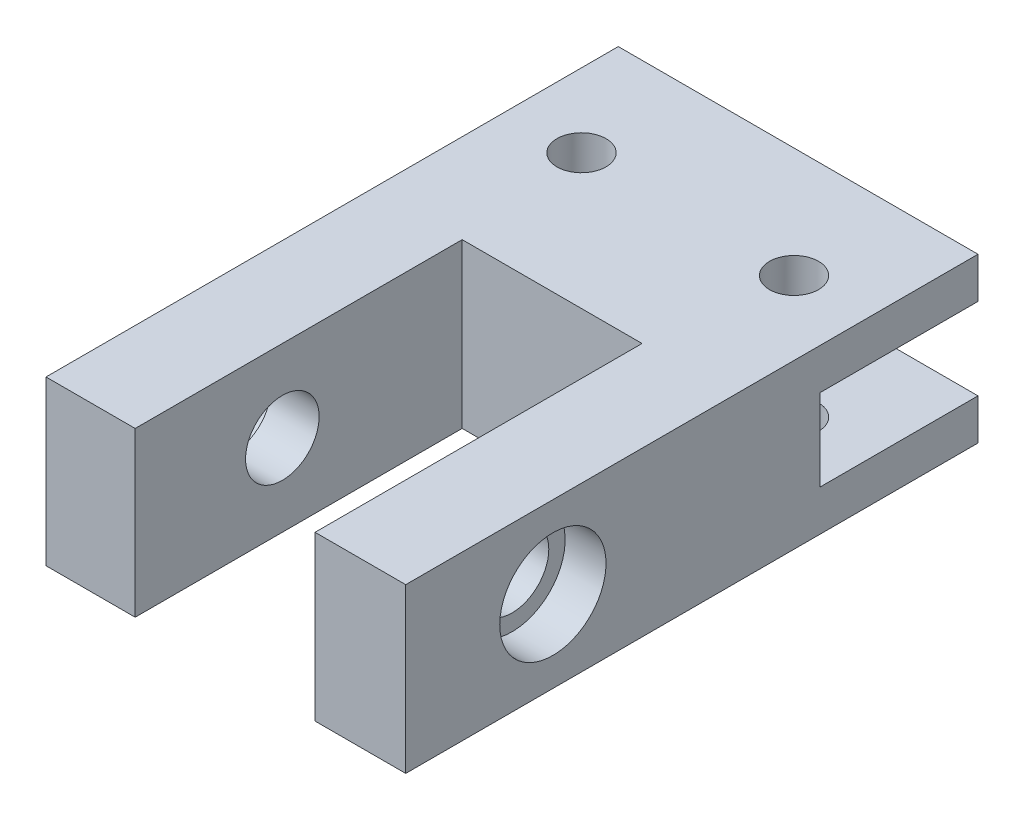
ISO-10303-21;
HEADER;
FILE_DESCRIPTION(('STEP AP214'),'2;1');
FILE_NAME('part.step','',(''),(''),'','','');
FILE_SCHEMA(('AUTOMOTIVE_DESIGN { 1 0 10303 214 1 1 1 1 }'));
ENDSEC;
DATA;
#1=APPLICATION_CONTEXT('core data for automotive mechanical design processes');
#2=APPLICATION_PROTOCOL_DEFINITION('international standard','automotive_design',2000,#1);
#3=PRODUCT_CONTEXT('',#1,'mechanical');
#4=PRODUCT('Part','Part','',(#3));
#5=PRODUCT_RELATED_PRODUCT_CATEGORY('part','',(#4));
#6=PRODUCT_DEFINITION_FORMATION('','',#4);
#7=PRODUCT_DEFINITION_CONTEXT('part definition',#1,'design');
#8=PRODUCT_DEFINITION('design','',#6,#7);
#9=PRODUCT_DEFINITION_SHAPE('','',#8);
#10=(LENGTH_UNIT() NAMED_UNIT(*) SI_UNIT(.MILLI.,.METRE.));
#11=(NAMED_UNIT(*) PLANE_ANGLE_UNIT() SI_UNIT($,.RADIAN.));
#12=(NAMED_UNIT(*) SI_UNIT($,.STERADIAN.) SOLID_ANGLE_UNIT());
#13=UNCERTAINTY_MEASURE_WITH_UNIT(LENGTH_MEASURE(1.E-05),#10,'distance_accuracy_value','');
#14=(GEOMETRIC_REPRESENTATION_CONTEXT(3) GLOBAL_UNCERTAINTY_ASSIGNED_CONTEXT((#13)) GLOBAL_UNIT_ASSIGNED_CONTEXT((#10,
#11,#12)) REPRESENTATION_CONTEXT('',''));
#15=CARTESIAN_POINT('',(0.,0.,0.));
#16=DIRECTION('',(0.,0.,1.));
#17=DIRECTION('',(1.,0.,0.));
#18=AXIS2_PLACEMENT_3D('',#15,#16,#17);
#19=CARTESIAN_POINT('',(22.,-10.,70.));
#20=DIRECTION('',(-1.,0.,0.));
#21=DIRECTION('',(0.,0.,1.));
#22=AXIS2_PLACEMENT_3D('',#19,#20,#21);
#23=PLANE('',#22);
#24=CARTESIAN_POINT('',(22.,0.,52.));
#25=DIRECTION('',(-1.,0.,0.));
#26=DIRECTION('',(0.,0.,1.));
#27=AXIS2_PLACEMENT_3D('',#24,#25,#26);
#28=CIRCLE('',#27,6.49999999999999);
#29=CARTESIAN_POINT('',(22.,0.,58.5));
#30=VERTEX_POINT('',#29);
#31=EDGE_CURVE('E275',#30,#30,#28,.T.);
#32=ORIENTED_EDGE('',*,*,#31,.T.);
#33=EDGE_LOOP('',(#32));
#34=FACE_BOUND('',#33,.T.);
#35=DIRECTION('',(0.,0.,-1.));
#36=VECTOR('',#35,1.);
#37=CARTESIAN_POINT('',(22.,5.,19.3492424049175));
#38=LINE('',#37,#36);
#39=CARTESIAN_POINT('',(22.,5.,19.3492424049175));
#40=VERTEX_POINT('',#39);
#41=CARTESIAN_POINT('',(22.,5.,0.));
#42=VERTEX_POINT('',#41);
#43=EDGE_CURVE('E424',#40,#42,#38,.T.);
#44=ORIENTED_EDGE('',*,*,#43,.T.);
#45=DIRECTION('',(0.,1.,0.));
#46=VECTOR('',#45,1.);
#47=CARTESIAN_POINT('',(22.,-10.,0.));
#48=LINE('',#47,#46);
#49=CARTESIAN_POINT('',(22.,10.,0.));
#50=VERTEX_POINT('',#49);
#51=EDGE_CURVE('E310',#42,#50,#48,.T.);
#52=ORIENTED_EDGE('',*,*,#51,.T.);
#53=DIRECTION('',(0.,0.,-1.));
#54=VECTOR('',#53,1.);
#55=CARTESIAN_POINT('',(22.,10.,70.));
#56=LINE('',#55,#54);
#57=CARTESIAN_POINT('',(22.,10.,70.));
#58=VERTEX_POINT('',#57);
#59=EDGE_CURVE('E11',#58,#50,#56,.T.);
#60=ORIENTED_EDGE('',*,*,#59,.F.);
#61=DIRECTION('',(0.,1.,0.));
#62=VECTOR('',#61,1.);
#63=CARTESIAN_POINT('',(22.,-10.,70.));
#64=LINE('',#63,#62);
#65=CARTESIAN_POINT('',(22.,-10.,70.));
#66=VERTEX_POINT('',#65);
#67=EDGE_CURVE('E321',#66,#58,#64,.T.);
#68=ORIENTED_EDGE('',*,*,#67,.F.);
#69=DIRECTION('',(0.,0.,-1.));
#70=VECTOR('',#69,1.);
#71=CARTESIAN_POINT('',(22.,-10.,70.));
#72=LINE('',#71,#70);
#73=CARTESIAN_POINT('',(22.,-10.,0.));
#74=VERTEX_POINT('',#73);
#75=EDGE_CURVE('E339',#66,#74,#72,.T.);
#76=ORIENTED_EDGE('',*,*,#75,.T.);
#77=CARTESIAN_POINT('',(22.,-5.,0.));
#78=VERTEX_POINT('',#77);
#79=EDGE_CURVE('E340',#74,#78,#48,.T.);
#80=ORIENTED_EDGE('',*,*,#79,.T.);
#81=DIRECTION('',(0.,0.,-1.));
#82=VECTOR('',#81,1.);
#83=CARTESIAN_POINT('',(22.,-5.,19.3492424049175));
#84=LINE('',#83,#82);
#85=CARTESIAN_POINT('',(22.,-5.,19.3492424049175));
#86=VERTEX_POINT('',#85);
#87=EDGE_CURVE('E64',#86,#78,#84,.T.);
#88=ORIENTED_EDGE('',*,*,#87,.F.);
#89=DIRECTION('',(0.,-1.,0.));
#90=VECTOR('',#89,1.);
#91=CARTESIAN_POINT('',(22.,5.,19.3492424049175));
#92=LINE('',#91,#90);
#93=EDGE_CURVE('E427',#40,#86,#92,.T.);
#94=ORIENTED_EDGE('',*,*,#93,.F.);
#95=EDGE_LOOP('',(#44,#52,#60,#68,#76,#80,#88,#94));
#96=FACE_BOUND('',#95,.T.);
#97=ADVANCED_FACE('F39',(#34,#96),#23,.F.);
#98=CARTESIAN_POINT('',(-22.,-10.,70.));
#99=DIRECTION('',(1.,0.,0.));
#100=DIRECTION('',(0.,0.,-1.));
#101=AXIS2_PLACEMENT_3D('',#98,#99,#100);
#102=PLANE('',#101);
#103=CARTESIAN_POINT('',(-22.,0.,52.));
#104=DIRECTION('',(-1.,0.,0.));
#105=DIRECTION('',(0.,0.,1.));
#106=AXIS2_PLACEMENT_3D('',#103,#104,#105);
#107=CIRCLE('',#106,6.49999999999999);
#108=CARTESIAN_POINT('',(-22.,0.,58.5));
#109=VERTEX_POINT('',#108);
#110=EDGE_CURVE('E261',#109,#109,#107,.T.);
#111=ORIENTED_EDGE('',*,*,#110,.F.);
#112=EDGE_LOOP('',(#111));
#113=FACE_BOUND('',#112,.T.);
#114=DIRECTION('',(0.,0.,1.));
#115=VECTOR('',#114,1.);
#116=CARTESIAN_POINT('',(-22.,5.,19.3492424049175));
#117=LINE('',#116,#115);
#118=CARTESIAN_POINT('',(-22.,5.,0.));
#119=VERTEX_POINT('',#118);
#120=CARTESIAN_POINT('',(-22.,5.,19.3492424049175));
#121=VERTEX_POINT('',#120);
#122=EDGE_CURVE('E235',#119,#121,#117,.T.);
#123=ORIENTED_EDGE('',*,*,#122,.T.);
#124=DIRECTION('',(0.,-1.,0.));
#125=VECTOR('',#124,1.);
#126=CARTESIAN_POINT('',(-22.,5.,19.3492424049175));
#127=LINE('',#126,#125);
#128=CARTESIAN_POINT('',(-22.,-5.,19.3492424049175));
#129=VERTEX_POINT('',#128);
#130=EDGE_CURVE('E239',#121,#129,#127,.T.);
#131=ORIENTED_EDGE('',*,*,#130,.T.);
#132=DIRECTION('',(0.,0.,1.));
#133=VECTOR('',#132,1.);
#134=CARTESIAN_POINT('',(-22.,-5.,19.3492424049175));
#135=LINE('',#134,#133);
#136=CARTESIAN_POINT('',(-22.,-5.,0.));
#137=VERTEX_POINT('',#136);
#138=EDGE_CURVE('E217',#137,#129,#135,.T.);
#139=ORIENTED_EDGE('',*,*,#138,.F.);
#140=DIRECTION('',(0.,-1.,0.));
#141=VECTOR('',#140,1.);
#142=CARTESIAN_POINT('',(-22.,-10.,0.));
#143=LINE('',#142,#141);
#144=CARTESIAN_POINT('',(-22.,-10.,0.));
#145=VERTEX_POINT('',#144);
#146=EDGE_CURVE('E346',#137,#145,#143,.T.);
#147=ORIENTED_EDGE('',*,*,#146,.T.);
#148=DIRECTION('',(0.,0.,-1.));
#149=VECTOR('',#148,1.);
#150=CARTESIAN_POINT('',(-22.,-10.,70.));
#151=LINE('',#150,#149);
#152=CARTESIAN_POINT('',(-22.,-10.,70.));
#153=VERTEX_POINT('',#152);
#154=EDGE_CURVE('E356',#153,#145,#151,.T.);
#155=ORIENTED_EDGE('',*,*,#154,.F.);
#156=DIRECTION('',(0.,-1.,0.));
#157=VECTOR('',#156,1.);
#158=CARTESIAN_POINT('',(-22.,-10.,70.));
#159=LINE('',#158,#157);
#160=CARTESIAN_POINT('',(-22.,10.,70.));
#161=VERTEX_POINT('',#160);
#162=EDGE_CURVE('E331',#161,#153,#159,.T.);
#163=ORIENTED_EDGE('',*,*,#162,.F.);
#164=DIRECTION('',(0.,0.,-1.));
#165=VECTOR('',#164,1.);
#166=CARTESIAN_POINT('',(-22.,10.,70.));
#167=LINE('',#166,#165);
#168=CARTESIAN_POINT('',(-22.,10.,0.));
#169=VERTEX_POINT('',#168);
#170=EDGE_CURVE('E48',#161,#169,#167,.T.);
#171=ORIENTED_EDGE('',*,*,#170,.T.);
#172=EDGE_CURVE('E347',#169,#119,#143,.T.);
#173=ORIENTED_EDGE('',*,*,#172,.T.);
#174=EDGE_LOOP('',(#123,#131,#139,#147,#155,#163,#171,#173));
#175=FACE_BOUND('',#174,.T.);
#176=ADVANCED_FACE('F405',(#113,#175),#102,.F.);
#177=CARTESIAN_POINT('',(0.,0.,0.));
#178=DIRECTION('',(0.,0.,-1.));
#179=DIRECTION('',(-1.,0.,0.));
#180=AXIS2_PLACEMENT_3D('',#177,#178,#179);
#181=PLANE('',#180);
#182=ORIENTED_EDGE('',*,*,#51,.F.);
#183=DIRECTION('',(-1.,0.,0.));
#184=VECTOR('',#183,1.);
#185=CARTESIAN_POINT('',(22.,5.,0.));
#186=LINE('',#185,#184);
#187=CARTESIAN_POINT('',(2.5,5.,0.));
#188=VERTEX_POINT('',#187);
#189=EDGE_CURVE('E192',#42,#188,#186,.T.);
#190=ORIENTED_EDGE('',*,*,#189,.T.);
#191=DIRECTION('',(0.,-1.,0.));
#192=VECTOR('',#191,1.);
#193=CARTESIAN_POINT('',(2.5,5.,0.));
#194=LINE('',#193,#192);
#195=CARTESIAN_POINT('',(2.5,-5.,0.));
#196=VERTEX_POINT('',#195);
#197=EDGE_CURVE('E172',#188,#196,#194,.T.);
#198=ORIENTED_EDGE('',*,*,#197,.T.);
#199=DIRECTION('',(-1.,0.,0.));
#200=VECTOR('',#199,1.);
#201=CARTESIAN_POINT('',(22.,-5.,0.));
#202=LINE('',#201,#200);
#203=EDGE_CURVE('E180',#78,#196,#202,.T.);
#204=ORIENTED_EDGE('',*,*,#203,.F.);
#205=ORIENTED_EDGE('',*,*,#79,.F.);
#206=DIRECTION('',(1.,0.,0.));
#207=VECTOR('',#206,1.);
#208=CARTESIAN_POINT('',(-22.,-10.,0.));
#209=LINE('',#208,#207);
#210=EDGE_CURVE('E326',#145,#74,#209,.T.);
#211=ORIENTED_EDGE('',*,*,#210,.F.);
#212=ORIENTED_EDGE('',*,*,#146,.F.);
#213=DIRECTION('',(-1.,0.,0.));
#214=VECTOR('',#213,1.);
#215=CARTESIAN_POINT('',(-2.5,-5.,0.));
#216=LINE('',#215,#214);
#217=CARTESIAN_POINT('',(-2.5,-5.,0.));
#218=VERTEX_POINT('',#217);
#219=EDGE_CURVE('E214',#218,#137,#216,.T.);
#220=ORIENTED_EDGE('',*,*,#219,.F.);
#221=DIRECTION('',(0.,-1.,0.));
#222=VECTOR('',#221,1.);
#223=CARTESIAN_POINT('',(-2.5,5.,0.));
#224=LINE('',#223,#222);
#225=CARTESIAN_POINT('',(-2.5,5.,0.));
#226=VERTEX_POINT('',#225);
#227=EDGE_CURVE('E243',#226,#218,#224,.T.);
#228=ORIENTED_EDGE('',*,*,#227,.F.);
#229=DIRECTION('',(-1.,0.,0.));
#230=VECTOR('',#229,1.);
#231=CARTESIAN_POINT('',(-2.5,5.,0.));
#232=LINE('',#231,#230);
#233=EDGE_CURVE('E231',#226,#119,#232,.T.);
#234=ORIENTED_EDGE('',*,*,#233,.T.);
#235=ORIENTED_EDGE('',*,*,#172,.F.);
#236=DIRECTION('',(-1.,0.,0.));
#237=VECTOR('',#236,1.);
#238=CARTESIAN_POINT('',(-22.,10.,0.));
#239=LINE('',#238,#237);
#240=EDGE_CURVE('E343',#50,#169,#239,.T.);
#241=ORIENTED_EDGE('',*,*,#240,.F.);
#242=EDGE_LOOP('',(#182,#190,#198,#204,#205,#211,#212,#220,#228,#234,#235,#241));
#243=FACE_BOUND('',#242,.T.);
#244=ADVANCED_FACE('F191',(#243),#181,.T.);
#245=CARTESIAN_POINT('',(13.,-19.,13.5));
#246=DIRECTION('',(0.,1.,0.));
#247=DIRECTION('',(0.,0.,1.));
#248=AXIS2_PLACEMENT_3D('',#245,#246,#247);
#249=CYLINDRICAL_SURFACE('',#248,3.);
#250=CARTESIAN_POINT('',(13.,10.,13.5));
#251=DIRECTION('',(0.,1.,0.));
#252=DIRECTION('',(0.,0.,1.));
#253=AXIS2_PLACEMENT_3D('',#250,#251,#252);
#254=CIRCLE('',#253,3.);
#255=CARTESIAN_POINT('',(13.,10.,16.5));
#256=VERTEX_POINT('',#255);
#257=EDGE_CURVE('E265',#256,#256,#254,.T.);
#258=ORIENTED_EDGE('',*,*,#257,.T.);
#259=EDGE_LOOP('',(#258));
#260=FACE_BOUND('',#259,.T.);
#261=CARTESIAN_POINT('',(13.,5.,13.5));
#262=DIRECTION('',(0.,-1.,0.));
#263=DIRECTION('',(0.,0.,-1.));
#264=AXIS2_PLACEMENT_3D('',#261,#262,#263);
#265=CIRCLE('',#264,3.);
#266=CARTESIAN_POINT('',(13.,5.,10.5));
#267=VERTEX_POINT('',#266);
#268=EDGE_CURVE('E42',#267,#267,#265,.F.);
#269=ORIENTED_EDGE('',*,*,#268,.F.);
#270=EDGE_LOOP('',(#269));
#271=FACE_BOUND('',#270,.T.);
#272=ADVANCED_FACE('F391',(#260,#271),#249,.F.);
#273=CARTESIAN_POINT('',(-13.,-19.,13.5));
#274=DIRECTION('',(0.,1.,0.));
#275=DIRECTION('',(0.,0.,1.));
#276=AXIS2_PLACEMENT_3D('',#273,#274,#275);
#277=CYLINDRICAL_SURFACE('',#276,3.);
#278=CARTESIAN_POINT('',(-13.,10.,13.5));
#279=DIRECTION('',(0.,-1.,0.));
#280=DIRECTION('',(0.,0.,1.));
#281=AXIS2_PLACEMENT_3D('',#278,#279,#280);
#282=CIRCLE('',#281,3.);
#283=CARTESIAN_POINT('',(-13.,10.,16.5));
#284=VERTEX_POINT('',#283);
#285=EDGE_CURVE('E251',#284,#284,#282,.T.);
#286=ORIENTED_EDGE('',*,*,#285,.F.);
#287=EDGE_LOOP('',(#286));
#288=FACE_BOUND('',#287,.T.);
#289=CARTESIAN_POINT('',(-13.,5.,13.5));
#290=DIRECTION('',(0.,-1.,0.));
#291=DIRECTION('',(0.,0.,-1.));
#292=AXIS2_PLACEMENT_3D('',#289,#290,#291);
#293=CIRCLE('',#292,3.);
#294=CARTESIAN_POINT('',(-13.,5.,10.5));
#295=VERTEX_POINT('',#294);
#296=EDGE_CURVE('E199',#295,#295,#293,.T.);
#297=ORIENTED_EDGE('',*,*,#296,.T.);
#298=EDGE_LOOP('',(#297));
#299=FACE_BOUND('',#298,.T.);
#300=ADVANCED_FACE('F393',(#288,#299),#277,.F.);
#301=CARTESIAN_POINT('',(0.,0.,70.));
#302=DIRECTION('',(0.,0.,-1.));
#303=DIRECTION('',(-1.,0.,0.));
#304=AXIS2_PLACEMENT_3D('',#301,#302,#303);
#305=PLANE('',#304);
#306=DIRECTION('',(1.,0.,0.));
#307=VECTOR('',#306,1.);
#308=CARTESIAN_POINT('',(-22.,-10.,70.));
#309=LINE('',#308,#307);
#310=CARTESIAN_POINT('',(-11.0921363727812,-10.,70.));
#311=VERTEX_POINT('',#310);
#312=EDGE_CURVE('E335',#153,#311,#309,.T.);
#313=ORIENTED_EDGE('',*,*,#312,.T.);
#314=DIRECTION('',(0.,-1.,0.));
#315=VECTOR('',#314,1.);
#316=CARTESIAN_POINT('',(-11.0921363727812,-10.,70.));
#317=LINE('',#316,#315);
#318=CARTESIAN_POINT('',(-11.0921363727812,10.,70.));
#319=VERTEX_POINT('',#318);
#320=EDGE_CURVE('E283',#319,#311,#317,.T.);
#321=ORIENTED_EDGE('',*,*,#320,.F.);
#322=DIRECTION('',(-1.,0.,0.));
#323=VECTOR('',#322,1.);
#324=CARTESIAN_POINT('',(-22.,10.,70.));
#325=LINE('',#324,#323);
#326=EDGE_CURVE('E325',#319,#161,#325,.T.);
#327=ORIENTED_EDGE('',*,*,#326,.T.);
#328=ORIENTED_EDGE('',*,*,#162,.T.);
#329=EDGE_LOOP('',(#313,#321,#327,#328));
#330=FACE_BOUND('',#329,.T.);
#331=ADVANCED_FACE('F401',(#330),#305,.F.);
#332=CARTESIAN_POINT('',(-22.,10.,70.));
#333=DIRECTION('',(0.,-1.,0.));
#334=DIRECTION('',(0.,0.,-1.));
#335=AXIS2_PLACEMENT_3D('',#332,#333,#334);
#336=PLANE('',#335);
#337=ORIENTED_EDGE('',*,*,#285,.T.);
#338=EDGE_LOOP('',(#337));
#339=FACE_BOUND('',#338,.T.);
#340=ORIENTED_EDGE('',*,*,#257,.F.);
#341=EDGE_LOOP('',(#340));
#342=FACE_BOUND('',#341,.T.);
#343=ORIENTED_EDGE('',*,*,#326,.F.);
#344=DIRECTION('',(0.,0.,1.));
#345=VECTOR('',#344,1.);
#346=CARTESIAN_POINT('',(-11.0921363727812,10.,30.));
#347=LINE('',#346,#345);
#348=CARTESIAN_POINT('',(-11.0921363727812,10.,30.));
#349=VERTEX_POINT('',#348);
#350=EDGE_CURVE('E307',#349,#319,#347,.T.);
#351=ORIENTED_EDGE('',*,*,#350,.F.);
#352=DIRECTION('',(-1.,0.,0.));
#353=VECTOR('',#352,1.);
#354=CARTESIAN_POINT('',(-11.0921363727812,10.,30.));
#355=LINE('',#354,#353);
#356=CARTESIAN_POINT('',(10.9078636272188,10.,30.));
#357=VERTEX_POINT('',#356);
#358=EDGE_CURVE('E298',#357,#349,#355,.T.);
#359=ORIENTED_EDGE('',*,*,#358,.F.);
#360=DIRECTION('',(0.,0.,1.));
#361=VECTOR('',#360,1.);
#362=CARTESIAN_POINT('',(10.9078636272188,10.,30.));
#363=LINE('',#362,#361);
#364=CARTESIAN_POINT('',(10.9078636272188,10.,70.));
#365=VERTEX_POINT('',#364);
#366=EDGE_CURVE('E311',#357,#365,#363,.T.);
#367=ORIENTED_EDGE('',*,*,#366,.T.);
#368=EDGE_CURVE('E327',#58,#365,#325,.T.);
#369=ORIENTED_EDGE('',*,*,#368,.F.);
#370=ORIENTED_EDGE('',*,*,#59,.T.);
#371=ORIENTED_EDGE('',*,*,#240,.T.);
#372=ORIENTED_EDGE('',*,*,#170,.F.);
#373=EDGE_LOOP('',(#343,#351,#359,#367,#369,#370,#371,#372));
#374=FACE_BOUND('',#373,.T.);
#375=ADVANCED_FACE('F451',(#339,#342,#374),#336,.F.);
#376=CARTESIAN_POINT('',(-22.,-10.,70.));
#377=DIRECTION('',(0.,1.,0.));
#378=DIRECTION('',(0.,0.,1.));
#379=AXIS2_PLACEMENT_3D('',#376,#377,#378);
#380=PLANE('',#379);
#381=CARTESIAN_POINT('',(-13.,-10.,13.5));
#382=DIRECTION('',(0.,1.,0.));
#383=DIRECTION('',(0.,0.,1.));
#384=AXIS2_PLACEMENT_3D('',#381,#382,#383);
#385=CIRCLE('',#384,3.);
#386=CARTESIAN_POINT('',(-13.,-10.,16.5));
#387=VERTEX_POINT('',#386);
#388=EDGE_CURVE('E255',#387,#387,#385,.F.);
#389=ORIENTED_EDGE('',*,*,#388,.F.);
#390=EDGE_LOOP('',(#389));
#391=FACE_BOUND('',#390,.T.);
#392=CARTESIAN_POINT('',(13.,-10.,13.5));
#393=DIRECTION('',(0.,1.,0.));
#394=DIRECTION('',(0.,0.,1.));
#395=AXIS2_PLACEMENT_3D('',#392,#393,#394);
#396=CIRCLE('',#395,3.);
#397=CARTESIAN_POINT('',(13.,-10.,16.5));
#398=VERTEX_POINT('',#397);
#399=EDGE_CURVE('E269',#398,#398,#396,.T.);
#400=ORIENTED_EDGE('',*,*,#399,.T.);
#401=EDGE_LOOP('',(#400));
#402=FACE_BOUND('',#401,.T.);
#403=DIRECTION('',(1.,0.,0.));
#404=VECTOR('',#403,1.);
#405=CARTESIAN_POINT('',(-11.0921363727812,-10.,30.));
#406=LINE('',#405,#404);
#407=CARTESIAN_POINT('',(-11.0921363727812,-10.,30.));
#408=VERTEX_POINT('',#407);
#409=CARTESIAN_POINT('',(10.9078636272188,-10.,30.));
#410=VERTEX_POINT('',#409);
#411=EDGE_CURVE('E289',#408,#410,#406,.T.);
#412=ORIENTED_EDGE('',*,*,#411,.F.);
#413=DIRECTION('',(0.,0.,1.));
#414=VECTOR('',#413,1.);
#415=CARTESIAN_POINT('',(-11.0921363727812,-10.,30.));
#416=LINE('',#415,#414);
#417=EDGE_CURVE('E302',#408,#311,#416,.T.);
#418=ORIENTED_EDGE('',*,*,#417,.T.);
#419=ORIENTED_EDGE('',*,*,#312,.F.);
#420=ORIENTED_EDGE('',*,*,#154,.T.);
#421=ORIENTED_EDGE('',*,*,#210,.T.);
#422=ORIENTED_EDGE('',*,*,#75,.F.);
#423=CARTESIAN_POINT('',(10.9078636272188,-10.,70.));
#424=VERTEX_POINT('',#423);
#425=EDGE_CURVE('E334',#424,#66,#309,.T.);
#426=ORIENTED_EDGE('',*,*,#425,.F.);
#427=DIRECTION('',(0.,0.,1.));
#428=VECTOR('',#427,1.);
#429=CARTESIAN_POINT('',(10.9078636272188,-10.,30.));
#430=LINE('',#429,#428);
#431=EDGE_CURVE('E315',#410,#424,#430,.T.);
#432=ORIENTED_EDGE('',*,*,#431,.F.);
#433=EDGE_LOOP('',(#412,#418,#419,#420,#421,#422,#426,#432));
#434=FACE_BOUND('',#433,.T.);
#435=ADVANCED_FACE('F447',(#391,#402,#434),#380,.F.);
#436=ORIENTED_EDGE('',*,*,#368,.T.);
#437=DIRECTION('',(0.,1.,0.));
#438=VECTOR('',#437,1.);
#439=CARTESIAN_POINT('',(10.9078636272188,-10.,70.));
#440=LINE('',#439,#438);
#441=EDGE_CURVE('E290',#424,#365,#440,.T.);
#442=ORIENTED_EDGE('',*,*,#441,.F.);
#443=ORIENTED_EDGE('',*,*,#425,.T.);
#444=ORIENTED_EDGE('',*,*,#67,.T.);
#445=EDGE_LOOP('',(#436,#442,#443,#444));
#446=FACE_BOUND('',#445,.T.);
#447=ADVANCED_FACE('F442',(#446),#305,.F.);
#448=CARTESIAN_POINT('',(-11.0921363727812,-10.,30.));
#449=DIRECTION('',(-1.,0.,0.));
#450=DIRECTION('',(0.,0.,1.));
#451=AXIS2_PLACEMENT_3D('',#448,#449,#450);
#452=PLANE('',#451);
#453=CARTESIAN_POINT('',(-11.0921363727812,0.,52.));
#454=DIRECTION('',(-1.,0.,0.));
#455=DIRECTION('',(0.,0.,1.));
#456=AXIS2_PLACEMENT_3D('',#453,#454,#455);
#457=CIRCLE('',#456,4.5);
#458=CARTESIAN_POINT('',(-11.0921363727812,0.,56.5));
#459=VERTEX_POINT('',#458);
#460=EDGE_CURVE('E279',#459,#459,#457,.T.);
#461=ORIENTED_EDGE('',*,*,#460,.T.);
#462=EDGE_LOOP('',(#461));
#463=FACE_BOUND('',#462,.T.);
#464=ORIENTED_EDGE('',*,*,#320,.T.);
#465=ORIENTED_EDGE('',*,*,#417,.F.);
#466=DIRECTION('',(0.,-1.,0.));
#467=VECTOR('',#466,1.);
#468=CARTESIAN_POINT('',(-11.0921363727812,-10.,30.));
#469=LINE('',#468,#467);
#470=EDGE_CURVE('E285',#349,#408,#469,.T.);
#471=ORIENTED_EDGE('',*,*,#470,.F.);
#472=ORIENTED_EDGE('',*,*,#350,.T.);
#473=EDGE_LOOP('',(#464,#465,#471,#472));
#474=FACE_BOUND('',#473,.T.);
#475=ADVANCED_FACE('F552',(#463,#474),#452,.F.);
#476=CARTESIAN_POINT('',(10.9078636272188,-10.,30.));
#477=DIRECTION('',(1.,0.,0.));
#478=DIRECTION('',(0.,0.,-1.));
#479=AXIS2_PLACEMENT_3D('',#476,#477,#478);
#480=PLANE('',#479);
#481=CARTESIAN_POINT('',(10.9078636272188,0.,52.));
#482=DIRECTION('',(1.,0.,0.));
#483=DIRECTION('',(0.,0.,-1.));
#484=AXIS2_PLACEMENT_3D('',#481,#482,#483);
#485=CIRCLE('',#484,4.5);
#486=CARTESIAN_POINT('',(10.9078636272188,0.,47.5));
#487=VERTEX_POINT('',#486);
#488=EDGE_CURVE('E284',#487,#487,#485,.T.);
#489=ORIENTED_EDGE('',*,*,#488,.T.);
#490=EDGE_LOOP('',(#489));
#491=FACE_BOUND('',#490,.T.);
#492=ORIENTED_EDGE('',*,*,#441,.T.);
#493=ORIENTED_EDGE('',*,*,#366,.F.);
#494=DIRECTION('',(0.,1.,0.));
#495=VECTOR('',#494,1.);
#496=CARTESIAN_POINT('',(10.9078636272188,-10.,30.));
#497=LINE('',#496,#495);
#498=EDGE_CURVE('E294',#410,#357,#497,.T.);
#499=ORIENTED_EDGE('',*,*,#498,.F.);
#500=ORIENTED_EDGE('',*,*,#431,.T.);
#501=EDGE_LOOP('',(#492,#493,#499,#500));
#502=FACE_BOUND('',#501,.T.);
#503=ADVANCED_FACE('F456',(#491,#502),#480,.F.);
#504=CARTESIAN_POINT('',(0.,0.,30.));
#505=DIRECTION('',(0.,0.,-1.));
#506=DIRECTION('',(-1.,0.,0.));
#507=AXIS2_PLACEMENT_3D('',#504,#505,#506);
#508=PLANE('',#507);
#509=ORIENTED_EDGE('',*,*,#470,.T.);
#510=ORIENTED_EDGE('',*,*,#411,.T.);
#511=ORIENTED_EDGE('',*,*,#498,.T.);
#512=ORIENTED_EDGE('',*,*,#358,.T.);
#513=EDGE_LOOP('',(#509,#510,#511,#512));
#514=FACE_BOUND('',#513,.T.);
#515=ADVANCED_FACE('F458',(#514),#508,.F.);
#516=CARTESIAN_POINT('',(-28.,0.,52.));
#517=DIRECTION('',(1.,0.,0.));
#518=DIRECTION('',(0.,0.,-1.));
#519=AXIS2_PLACEMENT_3D('',#516,#517,#518);
#520=CYLINDRICAL_SURFACE('',#519,4.5);
#521=CARTESIAN_POINT('',(17.,0.,52.));
#522=DIRECTION('',(-1.,0.,0.));
#523=DIRECTION('',(0.,0.,1.));
#524=AXIS2_PLACEMENT_3D('',#521,#522,#523);
#525=CIRCLE('',#524,4.5);
#526=CARTESIAN_POINT('',(17.,0.,56.5));
#527=VERTEX_POINT('',#526);
#528=EDGE_CURVE('E274',#527,#527,#525,.F.);
#529=ORIENTED_EDGE('',*,*,#528,.T.);
#530=EDGE_LOOP('',(#529));
#531=FACE_BOUND('',#530,.T.);
#532=ORIENTED_EDGE('',*,*,#488,.F.);
#533=EDGE_LOOP('',(#532));
#534=FACE_BOUND('',#533,.T.);
#535=ADVANCED_FACE('F548',(#531,#534),#520,.F.);
#536=CARTESIAN_POINT('',(-17.,0.,52.));
#537=DIRECTION('',(1.,0.,0.));
#538=DIRECTION('',(0.,0.,-1.));
#539=AXIS2_PLACEMENT_3D('',#536,#537,#538);
#540=CIRCLE('',#539,4.5);
#541=CARTESIAN_POINT('',(-17.,0.,47.5));
#542=VERTEX_POINT('',#541);
#543=EDGE_CURVE('E260',#542,#542,#540,.F.);
#544=ORIENTED_EDGE('',*,*,#543,.T.);
#545=EDGE_LOOP('',(#544));
#546=FACE_BOUND('',#545,.T.);
#547=ORIENTED_EDGE('',*,*,#460,.F.);
#548=EDGE_LOOP('',(#547));
#549=FACE_BOUND('',#548,.T.);
#550=ADVANCED_FACE('F544',(#546,#549),#520,.F.);
#551=CARTESIAN_POINT('',(17.,0.,52.));
#552=DIRECTION('',(-1.,0.,0.));
#553=DIRECTION('',(0.,0.,1.));
#554=AXIS2_PLACEMENT_3D('',#551,#552,#553);
#555=PLANE('',#554);
#556=CARTESIAN_POINT('',(17.,0.,52.));
#557=DIRECTION('',(-1.,0.,0.));
#558=DIRECTION('',(0.,0.,1.));
#559=AXIS2_PLACEMENT_3D('',#556,#557,#558);
#560=CIRCLE('',#559,6.49999999999999);
#561=CARTESIAN_POINT('',(17.,0.,58.5));
#562=VERTEX_POINT('',#561);
#563=EDGE_CURVE('E270',#562,#562,#560,.T.);
#564=ORIENTED_EDGE('',*,*,#563,.F.);
#565=EDGE_LOOP('',(#564));
#566=FACE_BOUND('',#565,.T.);
#567=ORIENTED_EDGE('',*,*,#528,.F.);
#568=EDGE_LOOP('',(#567));
#569=FACE_BOUND('',#568,.T.);
#570=ADVANCED_FACE('F547',(#566,#569),#555,.F.);
#571=CARTESIAN_POINT('',(17.,0.,52.));
#572=DIRECTION('',(1.,0.,0.));
#573=DIRECTION('',(0.,0.,-1.));
#574=AXIS2_PLACEMENT_3D('',#571,#572,#573);
#575=CYLINDRICAL_SURFACE('',#574,6.49999999999999);
#576=ORIENTED_EDGE('',*,*,#563,.T.);
#577=EDGE_LOOP('',(#576));
#578=FACE_BOUND('',#577,.T.);
#579=ORIENTED_EDGE('',*,*,#31,.F.);
#580=EDGE_LOOP('',(#579));
#581=FACE_BOUND('',#580,.T.);
#582=ADVANCED_FACE('F411',(#578,#581),#575,.F.);
#583=CARTESIAN_POINT('',(13.,-5.,13.5));
#584=DIRECTION('',(0.,-1.,0.));
#585=DIRECTION('',(0.,0.,-1.));
#586=AXIS2_PLACEMENT_3D('',#583,#584,#585);
#587=CIRCLE('',#586,3.);
#588=CARTESIAN_POINT('',(13.,-5.,10.5));
#589=VERTEX_POINT('',#588);
#590=EDGE_CURVE('E380',#589,#589,#587,.F.);
#591=ORIENTED_EDGE('',*,*,#590,.T.);
#592=EDGE_LOOP('',(#591));
#593=FACE_BOUND('',#592,.T.);
#594=ORIENTED_EDGE('',*,*,#399,.F.);
#595=EDGE_LOOP('',(#594));
#596=FACE_BOUND('',#595,.T.);
#597=ADVANCED_FACE('F396',(#593,#596),#249,.F.);
#598=CARTESIAN_POINT('',(-17.,0.,52.));
#599=DIRECTION('',(1.,0.,0.));
#600=DIRECTION('',(0.,0.,1.));
#601=AXIS2_PLACEMENT_3D('',#598,#599,#600);
#602=PLANE('',#601);
#603=CARTESIAN_POINT('',(-17.,0.,52.));
#604=DIRECTION('',(-1.,0.,0.));
#605=DIRECTION('',(0.,0.,1.));
#606=AXIS2_PLACEMENT_3D('',#603,#604,#605);
#607=CIRCLE('',#606,6.49999999999999);
#608=CARTESIAN_POINT('',(-17.,0.,58.5));
#609=VERTEX_POINT('',#608);
#610=EDGE_CURVE('E256',#609,#609,#607,.T.);
#611=ORIENTED_EDGE('',*,*,#610,.T.);
#612=EDGE_LOOP('',(#611));
#613=FACE_BOUND('',#612,.T.);
#614=ORIENTED_EDGE('',*,*,#543,.F.);
#615=EDGE_LOOP('',(#614));
#616=FACE_BOUND('',#615,.T.);
#617=ADVANCED_FACE('F410',(#613,#616),#602,.F.);
#618=CARTESIAN_POINT('',(-17.,0.,52.));
#619=DIRECTION('',(-1.,0.,0.));
#620=DIRECTION('',(0.,0.,1.));
#621=AXIS2_PLACEMENT_3D('',#618,#619,#620);
#622=CYLINDRICAL_SURFACE('',#621,6.49999999999999);
#623=ORIENTED_EDGE('',*,*,#610,.F.);
#624=EDGE_LOOP('',(#623));
#625=FACE_BOUND('',#624,.T.);
#626=ORIENTED_EDGE('',*,*,#110,.T.);
#627=EDGE_LOOP('',(#626));
#628=FACE_BOUND('',#627,.T.);
#629=ADVANCED_FACE('F530',(#625,#628),#622,.F.);
#630=CARTESIAN_POINT('',(-13.,-5.,13.5));
#631=DIRECTION('',(0.,-1.,0.));
#632=DIRECTION('',(0.,0.,-1.));
#633=AXIS2_PLACEMENT_3D('',#630,#631,#632);
#634=CIRCLE('',#633,3.);
#635=CARTESIAN_POINT('',(-13.,-5.,10.5));
#636=VERTEX_POINT('',#635);
#637=EDGE_CURVE('E194',#636,#636,#634,.T.);
#638=ORIENTED_EDGE('',*,*,#637,.F.);
#639=EDGE_LOOP('',(#638));
#640=FACE_BOUND('',#639,.T.);
#641=ORIENTED_EDGE('',*,*,#388,.T.);
#642=EDGE_LOOP('',(#641));
#643=FACE_BOUND('',#642,.T.);
#644=ADVANCED_FACE('F404',(#640,#643),#277,.F.);
#645=CARTESIAN_POINT('',(-17.3492424049175,5.,24.));
#646=DIRECTION('',(0.707106781186549,0.,-0.707106781186546));
#647=DIRECTION('',(-0.707106781186546,0.,-0.707106781186549));
#648=AXIS2_PLACEMENT_3D('',#645,#646,#647);
#649=PLANE('',#648);
#650=ORIENTED_EDGE('',*,*,#130,.F.);
#651=DIRECTION('',(0.707106781186546,0.,0.707106781186549));
#652=VECTOR('',#651,1.);
#653=CARTESIAN_POINT('',(-17.3492424049175,5.,24.));
#654=LINE('',#653,#652);
#655=CARTESIAN_POINT('',(-17.3492424049175,5.,24.));
#656=VERTEX_POINT('',#655);
#657=EDGE_CURVE('E221',#121,#656,#654,.T.);
#658=ORIENTED_EDGE('',*,*,#657,.T.);
#659=DIRECTION('',(0.,-1.,0.));
#660=VECTOR('',#659,1.);
#661=CARTESIAN_POINT('',(-17.3492424049175,5.,24.));
#662=LINE('',#661,#660);
#663=CARTESIAN_POINT('',(-17.3492424049175,-5.,24.));
#664=VERTEX_POINT('',#663);
#665=EDGE_CURVE('E188',#656,#664,#662,.T.);
#666=ORIENTED_EDGE('',*,*,#665,.T.);
#667=DIRECTION('',(0.707106781186546,0.,0.707106781186549));
#668=VECTOR('',#667,1.);
#669=CARTESIAN_POINT('',(-17.3492424049175,-5.,24.));
#670=LINE('',#669,#668);
#671=EDGE_CURVE('E205',#129,#664,#670,.T.);
#672=ORIENTED_EDGE('',*,*,#671,.F.);
#673=EDGE_LOOP('',(#650,#658,#666,#672));
#674=FACE_BOUND('',#673,.T.);
#675=ADVANCED_FACE('F524',(#674),#649,.T.);
#676=CARTESIAN_POINT('',(-17.3492424049175,5.,24.));
#677=DIRECTION('',(0.,0.,-1.));
#678=DIRECTION('',(-1.,0.,0.));
#679=AXIS2_PLACEMENT_3D('',#676,#677,#678);
#680=PLANE('',#679);
#681=ORIENTED_EDGE('',*,*,#665,.F.);
#682=DIRECTION('',(1.,0.,0.));
#683=VECTOR('',#682,1.);
#684=CARTESIAN_POINT('',(-17.3492424049175,5.,24.));
#685=LINE('',#684,#683);
#686=CARTESIAN_POINT('',(-2.5,5.,24.));
#687=VERTEX_POINT('',#686);
#688=EDGE_CURVE('E225',#656,#687,#685,.T.);
#689=ORIENTED_EDGE('',*,*,#688,.T.);
#690=DIRECTION('',(0.,-1.,0.));
#691=VECTOR('',#690,1.);
#692=CARTESIAN_POINT('',(-2.5,5.,24.));
#693=LINE('',#692,#691);
#694=CARTESIAN_POINT('',(-2.5,-5.,24.));
#695=VERTEX_POINT('',#694);
#696=EDGE_CURVE('E246',#687,#695,#693,.T.);
#697=ORIENTED_EDGE('',*,*,#696,.T.);
#698=DIRECTION('',(1.,0.,0.));
#699=VECTOR('',#698,1.);
#700=CARTESIAN_POINT('',(-17.3492424049175,-5.,24.));
#701=LINE('',#700,#699);
#702=EDGE_CURVE('E209',#664,#695,#701,.T.);
#703=ORIENTED_EDGE('',*,*,#702,.F.);
#704=EDGE_LOOP('',(#681,#689,#697,#703));
#705=FACE_BOUND('',#704,.T.);
#706=ADVANCED_FACE('F520',(#705),#680,.T.);
#707=CARTESIAN_POINT('',(-2.5,5.,24.));
#708=DIRECTION('',(-1.,0.,0.));
#709=DIRECTION('',(0.,0.,1.));
#710=AXIS2_PLACEMENT_3D('',#707,#708,#709);
#711=PLANE('',#710);
#712=ORIENTED_EDGE('',*,*,#696,.F.);
#713=DIRECTION('',(0.,0.,-1.));
#714=VECTOR('',#713,1.);
#715=CARTESIAN_POINT('',(-2.5,5.,24.));
#716=LINE('',#715,#714);
#717=EDGE_CURVE('E228',#687,#226,#716,.T.);
#718=ORIENTED_EDGE('',*,*,#717,.T.);
#719=ORIENTED_EDGE('',*,*,#227,.T.);
#720=DIRECTION('',(0.,0.,-1.));
#721=VECTOR('',#720,1.);
#722=CARTESIAN_POINT('',(-2.5,-5.,24.));
#723=LINE('',#722,#721);
#724=EDGE_CURVE('E56',#695,#218,#723,.T.);
#725=ORIENTED_EDGE('',*,*,#724,.F.);
#726=EDGE_LOOP('',(#712,#718,#719,#725));
#727=FACE_BOUND('',#726,.T.);
#728=ADVANCED_FACE('F516',(#727),#711,.T.);
#729=CARTESIAN_POINT('',(0.,5.,0.));
#730=DIRECTION('',(0.,-1.,0.));
#731=DIRECTION('',(0.,0.,-1.));
#732=AXIS2_PLACEMENT_3D('',#729,#730,#731);
#733=PLANE('',#732);
#734=ORIENTED_EDGE('',*,*,#296,.F.);
#735=EDGE_LOOP('',(#734));
#736=FACE_BOUND('',#735,.T.);
#737=ORIENTED_EDGE('',*,*,#657,.F.);
#738=ORIENTED_EDGE('',*,*,#122,.F.);
#739=ORIENTED_EDGE('',*,*,#233,.F.);
#740=ORIENTED_EDGE('',*,*,#717,.F.);
#741=ORIENTED_EDGE('',*,*,#688,.F.);
#742=EDGE_LOOP('',(#737,#738,#739,#740,#741));
#743=FACE_BOUND('',#742,.T.);
#744=ADVANCED_FACE('F504',(#736,#743),#733,.T.);
#745=CARTESIAN_POINT('',(0.,-5.,0.));
#746=DIRECTION('',(0.,-1.,0.));
#747=DIRECTION('',(0.,0.,-1.));
#748=AXIS2_PLACEMENT_3D('',#745,#746,#747);
#749=PLANE('',#748);
#750=ORIENTED_EDGE('',*,*,#637,.T.);
#751=EDGE_LOOP('',(#750));
#752=FACE_BOUND('',#751,.T.);
#753=ORIENTED_EDGE('',*,*,#671,.T.);
#754=ORIENTED_EDGE('',*,*,#702,.T.);
#755=ORIENTED_EDGE('',*,*,#724,.T.);
#756=ORIENTED_EDGE('',*,*,#219,.T.);
#757=ORIENTED_EDGE('',*,*,#138,.T.);
#758=EDGE_LOOP('',(#753,#754,#755,#756,#757));
#759=FACE_BOUND('',#758,.T.);
#760=ADVANCED_FACE('F497',(#752,#759),#749,.F.);
#761=CARTESIAN_POINT('',(0.,5.,0.));
#762=DIRECTION('',(0.,-1.,0.));
#763=DIRECTION('',(0.,0.,-1.));
#764=AXIS2_PLACEMENT_3D('',#761,#762,#763);
#765=PLANE('',#764);
#766=ORIENTED_EDGE('',*,*,#189,.F.);
#767=ORIENTED_EDGE('',*,*,#43,.F.);
#768=DIRECTION('',(0.707106781186546,0.,-0.707106781186549));
#769=VECTOR('',#768,1.);
#770=CARTESIAN_POINT('',(17.3492424049175,5.,24.));
#771=LINE('',#770,#769);
#772=CARTESIAN_POINT('',(17.3492424049175,5.,24.));
#773=VERTEX_POINT('',#772);
#774=EDGE_CURVE('E431',#773,#40,#771,.T.);
#775=ORIENTED_EDGE('',*,*,#774,.F.);
#776=DIRECTION('',(1.,0.,0.));
#777=VECTOR('',#776,1.);
#778=CARTESIAN_POINT('',(17.3492424049175,5.,24.));
#779=LINE('',#778,#777);
#780=CARTESIAN_POINT('',(2.5,5.,24.));
#781=VERTEX_POINT('',#780);
#782=EDGE_CURVE('E481',#781,#773,#779,.T.);
#783=ORIENTED_EDGE('',*,*,#782,.F.);
#784=DIRECTION('',(0.,0.,1.));
#785=VECTOR('',#784,1.);
#786=CARTESIAN_POINT('',(2.5,5.,24.));
#787=LINE('',#786,#785);
#788=EDGE_CURVE('E474',#188,#781,#787,.T.);
#789=ORIENTED_EDGE('',*,*,#788,.F.);
#790=EDGE_LOOP('',(#766,#767,#775,#783,#789));
#791=FACE_BOUND('',#790,.T.);
#792=ORIENTED_EDGE('',*,*,#268,.T.);
#793=EDGE_LOOP('',(#792));
#794=FACE_BOUND('',#793,.T.);
#795=ADVANCED_FACE('F389',(#791,#794),#765,.T.);
#796=CARTESIAN_POINT('',(0.,-5.,0.));
#797=DIRECTION('',(0.,-1.,0.));
#798=DIRECTION('',(0.,0.,-1.));
#799=AXIS2_PLACEMENT_3D('',#796,#797,#798);
#800=PLANE('',#799);
#801=ORIENTED_EDGE('',*,*,#203,.T.);
#802=DIRECTION('',(0.,0.,1.));
#803=VECTOR('',#802,1.);
#804=CARTESIAN_POINT('',(2.5,-5.,24.));
#805=LINE('',#804,#803);
#806=CARTESIAN_POINT('',(2.5,-5.,24.));
#807=VERTEX_POINT('',#806);
#808=EDGE_CURVE('E169',#196,#807,#805,.T.);
#809=ORIENTED_EDGE('',*,*,#808,.T.);
#810=DIRECTION('',(1.,0.,0.));
#811=VECTOR('',#810,1.);
#812=CARTESIAN_POINT('',(17.3492424049175,-5.,24.));
#813=LINE('',#812,#811);
#814=CARTESIAN_POINT('',(17.3492424049175,-5.,24.));
#815=VERTEX_POINT('',#814);
#816=EDGE_CURVE('E179',#807,#815,#813,.T.);
#817=ORIENTED_EDGE('',*,*,#816,.T.);
#818=DIRECTION('',(0.707106781186546,0.,-0.707106781186549));
#819=VECTOR('',#818,1.);
#820=CARTESIAN_POINT('',(17.3492424049175,-5.,24.));
#821=LINE('',#820,#819);
#822=EDGE_CURVE('E470',#815,#86,#821,.T.);
#823=ORIENTED_EDGE('',*,*,#822,.T.);
#824=ORIENTED_EDGE('',*,*,#87,.T.);
#825=EDGE_LOOP('',(#801,#809,#817,#823,#824));
#826=FACE_BOUND('',#825,.T.);
#827=ORIENTED_EDGE('',*,*,#590,.F.);
#828=EDGE_LOOP('',(#827));
#829=FACE_BOUND('',#828,.T.);
#830=ADVANCED_FACE('F182',(#826,#829),#800,.F.);
#831=CARTESIAN_POINT('',(2.5,5.,24.));
#832=DIRECTION('',(1.,0.,0.));
#833=DIRECTION('',(0.,0.,-1.));
#834=AXIS2_PLACEMENT_3D('',#831,#832,#833);
#835=PLANE('',#834);
#836=ORIENTED_EDGE('',*,*,#197,.F.);
#837=ORIENTED_EDGE('',*,*,#788,.T.);
#838=DIRECTION('',(0.,-1.,0.));
#839=VECTOR('',#838,1.);
#840=CARTESIAN_POINT('',(2.5,5.,24.));
#841=LINE('',#840,#839);
#842=EDGE_CURVE('E175',#781,#807,#841,.T.);
#843=ORIENTED_EDGE('',*,*,#842,.T.);
#844=ORIENTED_EDGE('',*,*,#808,.F.);
#845=EDGE_LOOP('',(#836,#837,#843,#844));
#846=FACE_BOUND('',#845,.T.);
#847=ADVANCED_FACE('F170',(#846),#835,.T.);
#848=CARTESIAN_POINT('',(17.3492424049175,5.,24.));
#849=DIRECTION('',(0.,0.,-1.));
#850=DIRECTION('',(-1.,0.,0.));
#851=AXIS2_PLACEMENT_3D('',#848,#849,#850);
#852=PLANE('',#851);
#853=ORIENTED_EDGE('',*,*,#842,.F.);
#854=ORIENTED_EDGE('',*,*,#782,.T.);
#855=DIRECTION('',(0.,-1.,0.));
#856=VECTOR('',#855,1.);
#857=CARTESIAN_POINT('',(17.3492424049175,5.,24.));
#858=LINE('',#857,#856);
#859=EDGE_CURVE('E201',#773,#815,#858,.T.);
#860=ORIENTED_EDGE('',*,*,#859,.T.);
#861=ORIENTED_EDGE('',*,*,#816,.F.);
#862=EDGE_LOOP('',(#853,#854,#860,#861));
#863=FACE_BOUND('',#862,.T.);
#864=ADVANCED_FACE('F491',(#863),#852,.T.);
#865=CARTESIAN_POINT('',(17.3492424049175,5.,24.));
#866=DIRECTION('',(-0.707106781186549,0.,-0.707106781186546));
#867=DIRECTION('',(-0.707106781186546,0.,0.707106781186549));
#868=AXIS2_PLACEMENT_3D('',#865,#866,#867);
#869=PLANE('',#868);
#870=ORIENTED_EDGE('',*,*,#859,.F.);
#871=ORIENTED_EDGE('',*,*,#774,.T.);
#872=ORIENTED_EDGE('',*,*,#93,.T.);
#873=ORIENTED_EDGE('',*,*,#822,.F.);
#874=EDGE_LOOP('',(#870,#871,#872,#873));
#875=FACE_BOUND('',#874,.T.);
#876=ADVANCED_FACE('F494',(#875),#869,.T.);
#877=CLOSED_SHELL('',(#97,#176,#244,#272,#300,#331,#375,#435,#447,#475,#503,#515,#535,#550,#570,
#582,#597,#617,#629,#644,#675,#706,#728,#744,#760,#795,#830,#847,#864,#876));
#878=MANIFOLD_SOLID_BREP('B2',#877);
#879=ADVANCED_BREP_SHAPE_REPRESENTATION('',(#18,#878),#14);
#880=SHAPE_DEFINITION_REPRESENTATION(#9,#879);
ENDSEC;
END-ISO-10303-21;
